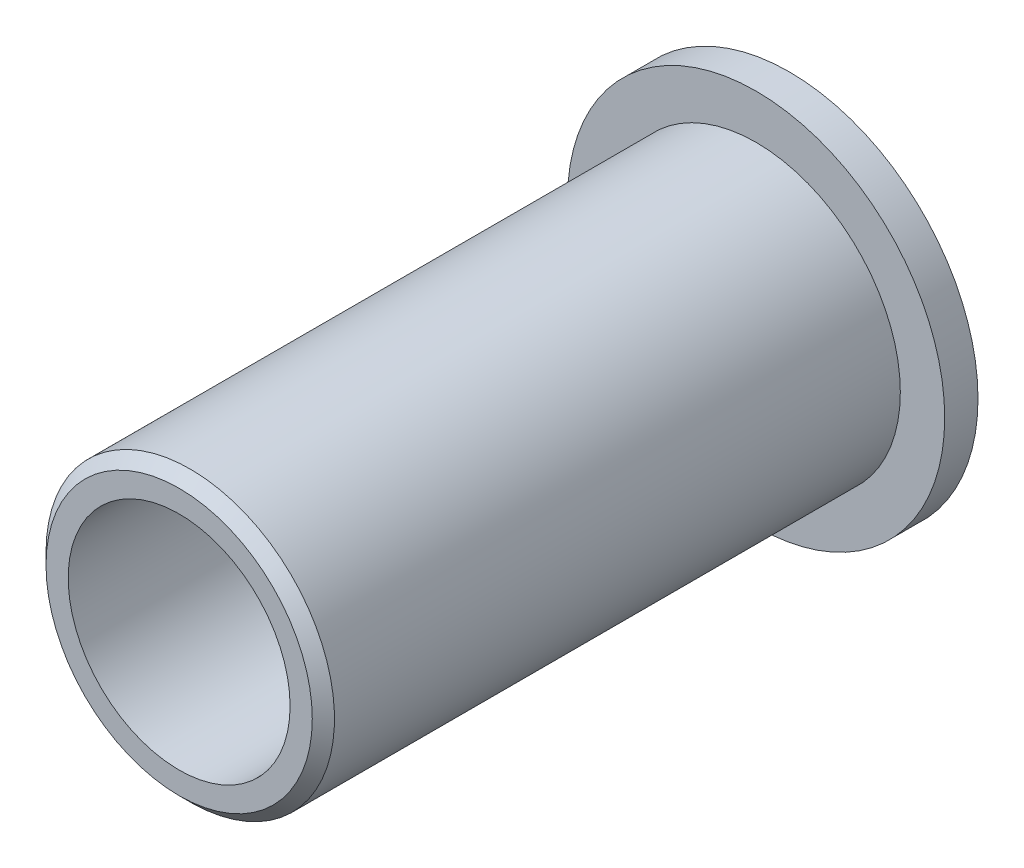
ISO-10303-21;
HEADER;
FILE_DESCRIPTION(('STEP AP214'),'2;1');
FILE_NAME('part.step','',(''),(''),'','','');
FILE_SCHEMA(('AUTOMOTIVE_DESIGN { 1 0 10303 214 1 1 1 1 }'));
ENDSEC;
DATA;
#1=APPLICATION_CONTEXT('core data for automotive mechanical design processes');
#2=APPLICATION_PROTOCOL_DEFINITION('international standard','automotive_design',2000,#1);
#3=PRODUCT_CONTEXT('',#1,'mechanical');
#4=PRODUCT('Part','Part','',(#3));
#5=PRODUCT_RELATED_PRODUCT_CATEGORY('part','',(#4));
#6=PRODUCT_DEFINITION_FORMATION('','',#4);
#7=PRODUCT_DEFINITION_CONTEXT('part definition',#1,'design');
#8=PRODUCT_DEFINITION('design','',#6,#7);
#9=PRODUCT_DEFINITION_SHAPE('','',#8);
#10=(LENGTH_UNIT() NAMED_UNIT(*) SI_UNIT(.MILLI.,.METRE.));
#11=(NAMED_UNIT(*) PLANE_ANGLE_UNIT() SI_UNIT($,.RADIAN.));
#12=(NAMED_UNIT(*) SI_UNIT($,.STERADIAN.) SOLID_ANGLE_UNIT());
#13=UNCERTAINTY_MEASURE_WITH_UNIT(LENGTH_MEASURE(1.E-05),#10,'distance_accuracy_value','');
#14=(GEOMETRIC_REPRESENTATION_CONTEXT(3) GLOBAL_UNCERTAINTY_ASSIGNED_CONTEXT((#13)) GLOBAL_UNIT_ASSIGNED_CONTEXT((#10,
#11,#12)) REPRESENTATION_CONTEXT('',''));
#15=CARTESIAN_POINT('',(0.,0.,0.));
#16=DIRECTION('',(0.,0.,1.));
#17=DIRECTION('',(1.,0.,0.));
#18=AXIS2_PLACEMENT_3D('',#15,#16,#17);
#19=CARTESIAN_POINT('',(0.,0.,55.));
#20=DIRECTION('',(0.,0.,-1.));
#21=DIRECTION('',(-1.,0.,0.));
#22=AXIS2_PLACEMENT_3D('',#19,#20,#21);
#23=CYLINDRICAL_SURFACE('',#22,13.);
#24=CARTESIAN_POINT('',(0.,0.,3.));
#25=DIRECTION('',(0.,0.,1.));
#26=DIRECTION('',(1.,0.,0.));
#27=AXIS2_PLACEMENT_3D('',#24,#25,#26);
#28=CIRCLE('',#27,13.);
#29=CARTESIAN_POINT('',(13.,0.,3.));
#30=VERTEX_POINT('',#29);
#31=EDGE_CURVE('E10',#30,#30,#28,.F.);
#32=ORIENTED_EDGE('',*,*,#31,.F.);
#33=EDGE_LOOP('',(#32));
#34=FACE_BOUND('',#33,.T.);
#35=CARTESIAN_POINT('',(0.,0.,54.));
#36=DIRECTION('',(0.,0.,-1.));
#37=DIRECTION('',(-1.,0.,0.));
#38=AXIS2_PLACEMENT_3D('',#35,#36,#37);
#39=CIRCLE('',#38,13.);
#40=CARTESIAN_POINT('',(-13.,0.,54.));
#41=VERTEX_POINT('',#40);
#42=EDGE_CURVE('E44',#41,#41,#39,.T.);
#43=ORIENTED_EDGE('',*,*,#42,.T.);
#44=EDGE_LOOP('',(#43));
#45=FACE_BOUND('',#44,.T.);
#46=ADVANCED_FACE('F15',(#34,#45),#23,.T.);
#47=CARTESIAN_POINT('',(0.,0.,55.));
#48=DIRECTION('',(0.,0.,-1.));
#49=DIRECTION('',(-1.,0.,0.));
#50=AXIS2_PLACEMENT_3D('',#47,#48,#49);
#51=CYLINDRICAL_SURFACE('',#50,10.);
#52=CARTESIAN_POINT('',(0.,0.,55.));
#53=DIRECTION('',(0.,0.,1.));
#54=DIRECTION('',(1.,0.,0.));
#55=AXIS2_PLACEMENT_3D('',#52,#53,#54);
#56=CIRCLE('',#55,10.);
#57=CARTESIAN_POINT('',(10.,0.,55.));
#58=VERTEX_POINT('',#57);
#59=EDGE_CURVE('E48',#58,#58,#56,.T.);
#60=ORIENTED_EDGE('',*,*,#59,.T.);
#61=EDGE_LOOP('',(#60));
#62=FACE_BOUND('',#61,.T.);
#63=CARTESIAN_POINT('',(0.,0.,0.));
#64=DIRECTION('',(0.,0.,1.));
#65=DIRECTION('',(1.,0.,0.));
#66=AXIS2_PLACEMENT_3D('',#63,#64,#65);
#67=CIRCLE('',#66,10.);
#68=CARTESIAN_POINT('',(10.,0.,0.));
#69=VERTEX_POINT('',#68);
#70=EDGE_CURVE('E49',#69,#69,#67,.T.);
#71=ORIENTED_EDGE('',*,*,#70,.F.);
#72=EDGE_LOOP('',(#71));
#73=FACE_BOUND('',#72,.T.);
#74=ADVANCED_FACE('F92',(#62,#73),#51,.F.);
#75=CARTESIAN_POINT('',(0.,0.,55.));
#76=DIRECTION('',(0.,0.,-1.));
#77=DIRECTION('',(-1.,0.,0.));
#78=AXIS2_PLACEMENT_3D('',#75,#76,#77);
#79=PLANE('',#78);
#80=CARTESIAN_POINT('',(0.,0.,55.));
#81=DIRECTION('',(0.,0.,-1.));
#82=DIRECTION('',(-1.,0.,0.));
#83=AXIS2_PLACEMENT_3D('',#80,#81,#82);
#84=CIRCLE('',#83,12.);
#85=CARTESIAN_POINT('',(-12.,0.,55.));
#86=VERTEX_POINT('',#85);
#87=EDGE_CURVE('E38',#86,#86,#84,.F.);
#88=ORIENTED_EDGE('',*,*,#87,.T.);
#89=EDGE_LOOP('',(#88));
#90=FACE_BOUND('',#89,.T.);
#91=ORIENTED_EDGE('',*,*,#59,.F.);
#92=EDGE_LOOP('',(#91));
#93=FACE_BOUND('',#92,.T.);
#94=ADVANCED_FACE('F98',(#90,#93),#79,.F.);
#95=CARTESIAN_POINT('',(0.,0.,0.));
#96=DIRECTION('',(0.,0.,-1.));
#97=DIRECTION('',(-1.,0.,0.));
#98=AXIS2_PLACEMENT_3D('',#95,#96,#97);
#99=PLANE('',#98);
#100=CARTESIAN_POINT('',(0.,0.,0.));
#101=DIRECTION('',(0.,0.,-1.));
#102=DIRECTION('',(-1.,0.,0.));
#103=AXIS2_PLACEMENT_3D('',#100,#101,#102);
#104=CIRCLE('',#103,12.8);
#105=CARTESIAN_POINT('',(-12.8,0.,0.));
#106=VERTEX_POINT('',#105);
#107=EDGE_CURVE('E31',#106,#106,#104,.T.);
#108=ORIENTED_EDGE('',*,*,#107,.T.);
#109=EDGE_LOOP('',(#108));
#110=FACE_BOUND('',#109,.T.);
#111=ORIENTED_EDGE('',*,*,#70,.T.);
#112=EDGE_LOOP('',(#111));
#113=FACE_BOUND('',#112,.T.);
#114=ADVANCED_FACE('F105',(#110,#113),#99,.T.);
#115=CARTESIAN_POINT('',(0.,0.,54.));
#116=DIRECTION('',(0.,0.,-1.));
#117=DIRECTION('',(-1.,0.,0.));
#118=AXIS2_PLACEMENT_3D('',#115,#116,#117);
#119=CONICAL_SURFACE('',#118,13.,0.785398163397448);
#120=ORIENTED_EDGE('',*,*,#87,.F.);
#121=EDGE_LOOP('',(#120));
#122=FACE_BOUND('',#121,.T.);
#123=ORIENTED_EDGE('',*,*,#42,.F.);
#124=EDGE_LOOP('',(#123));
#125=FACE_BOUND('',#124,.T.);
#126=ADVANCED_FACE('F103',(#122,#125),#119,.T.);
#127=CARTESIAN_POINT('',(0.,0.,0.));
#128=DIRECTION('',(0.,0.,1.));
#129=DIRECTION('',(1.,0.,0.));
#130=AXIS2_PLACEMENT_3D('',#127,#128,#129);
#131=CONICAL_SURFACE('',#130,12.8,0.785398163397452);
#132=CARTESIAN_POINT('',(0.,0.,0.2));
#133=DIRECTION('',(0.,0.,-1.));
#134=DIRECTION('',(-1.,0.,0.));
#135=AXIS2_PLACEMENT_3D('',#132,#133,#134);
#136=CIRCLE('',#135,13.);
#137=CARTESIAN_POINT('',(-13.,0.,0.2));
#138=VERTEX_POINT('',#137);
#139=EDGE_CURVE('E23',#138,#138,#136,.F.);
#140=ORIENTED_EDGE('',*,*,#139,.F.);
#141=EDGE_LOOP('',(#140));
#142=FACE_BOUND('',#141,.T.);
#143=ORIENTED_EDGE('',*,*,#107,.F.);
#144=EDGE_LOOP('',(#143));
#145=FACE_BOUND('',#144,.T.);
#146=ADVANCED_FACE('F17',(#142,#145),#131,.T.);
#147=CARTESIAN_POINT('',(0.,0.,3.));
#148=DIRECTION('',(0.,0.,-1.));
#149=DIRECTION('',(-1.,0.,0.));
#150=AXIS2_PLACEMENT_3D('',#147,#148,#149);
#151=CYLINDRICAL_SURFACE('',#150,17.);
#152=CARTESIAN_POINT('',(0.,0.,3.));
#153=DIRECTION('',(0.,0.,1.));
#154=DIRECTION('',(1.,0.,0.));
#155=AXIS2_PLACEMENT_3D('',#152,#153,#154);
#156=CIRCLE('',#155,17.);
#157=CARTESIAN_POINT('',(17.,0.,3.));
#158=VERTEX_POINT('',#157);
#159=EDGE_CURVE('E53',#158,#158,#156,.T.);
#160=ORIENTED_EDGE('',*,*,#159,.F.);
#161=EDGE_LOOP('',(#160));
#162=FACE_BOUND('',#161,.T.);
#163=CARTESIAN_POINT('',(0.,0.,0.));
#164=DIRECTION('',(0.,0.,1.));
#165=DIRECTION('',(1.,0.,0.));
#166=AXIS2_PLACEMENT_3D('',#163,#164,#165);
#167=CIRCLE('',#166,17.);
#168=CARTESIAN_POINT('',(17.,0.,0.));
#169=VERTEX_POINT('',#168);
#170=EDGE_CURVE('E61',#169,#169,#167,.T.);
#171=ORIENTED_EDGE('',*,*,#170,.T.);
#172=EDGE_LOOP('',(#171));
#173=FACE_BOUND('',#172,.T.);
#174=ADVANCED_FACE('F71',(#162,#173),#151,.T.);
#175=CARTESIAN_POINT('',(0.,0.,3.));
#176=DIRECTION('',(0.,0.,-1.));
#177=DIRECTION('',(-1.,0.,0.));
#178=AXIS2_PLACEMENT_3D('',#175,#176,#177);
#179=CYLINDRICAL_SURFACE('',#178,13.);
#180=ORIENTED_EDGE('',*,*,#139,.T.);
#181=EDGE_LOOP('',(#180));
#182=FACE_BOUND('',#181,.T.);
#183=CARTESIAN_POINT('',(0.,0.,0.));
#184=DIRECTION('',(0.,0.,-1.));
#185=DIRECTION('',(1.,0.,0.));
#186=AXIS2_PLACEMENT_3D('',#183,#184,#185);
#187=CIRCLE('',#186,13.);
#188=CARTESIAN_POINT('',(13.,0.,0.));
#189=VERTEX_POINT('',#188);
#190=EDGE_CURVE('E57',#189,#189,#187,.T.);
#191=ORIENTED_EDGE('',*,*,#190,.T.);
#192=EDGE_LOOP('',(#191));
#193=FACE_BOUND('',#192,.T.);
#194=ADVANCED_FACE('F74',(#182,#193),#179,.F.);
#195=CARTESIAN_POINT('',(0.,0.,3.));
#196=DIRECTION('',(0.,0.,1.));
#197=DIRECTION('',(1.,0.,0.));
#198=AXIS2_PLACEMENT_3D('',#195,#196,#197);
#199=PLANE('',#198);
#200=ORIENTED_EDGE('',*,*,#159,.T.);
#201=EDGE_LOOP('',(#200));
#202=FACE_BOUND('',#201,.T.);
#203=ORIENTED_EDGE('',*,*,#31,.T.);
#204=EDGE_LOOP('',(#203));
#205=FACE_BOUND('',#204,.T.);
#206=ADVANCED_FACE('F69',(#202,#205),#199,.T.);
#207=CARTESIAN_POINT('',(0.,0.,0.));
#208=DIRECTION('',(0.,0.,1.));
#209=DIRECTION('',(1.,0.,0.));
#210=AXIS2_PLACEMENT_3D('',#207,#208,#209);
#211=PLANE('',#210);
#212=ORIENTED_EDGE('',*,*,#170,.F.);
#213=EDGE_LOOP('',(#212));
#214=FACE_BOUND('',#213,.T.);
#215=ORIENTED_EDGE('',*,*,#190,.F.);
#216=EDGE_LOOP('',(#215));
#217=FACE_BOUND('',#216,.T.);
#218=ADVANCED_FACE('F78',(#214,#217),#211,.F.);
#219=CLOSED_SHELL('',(#46,#74,#94,#114,#126,#146,#174,#194,#206,#218));
#220=MANIFOLD_SOLID_BREP('B1',#219);
#221=ADVANCED_BREP_SHAPE_REPRESENTATION('',(#18,#220),#14);
#222=SHAPE_DEFINITION_REPRESENTATION(#9,#221);
ENDSEC;
END-ISO-10303-21;
